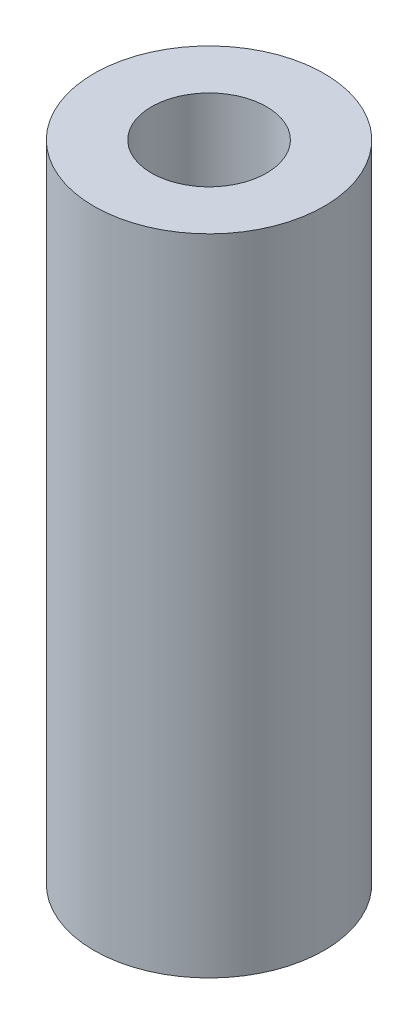
ISO-10303-21;
HEADER;
FILE_DESCRIPTION(('STEP AP214'),'2;1');
FILE_NAME('part.step','',(''),(''),'','','');
FILE_SCHEMA(('AUTOMOTIVE_DESIGN { 1 0 10303 214 1 1 1 1 }'));
ENDSEC;
DATA;
#1=APPLICATION_CONTEXT('core data for automotive mechanical design processes');
#2=APPLICATION_PROTOCOL_DEFINITION('international standard','automotive_design',2000,#1);
#3=PRODUCT_CONTEXT('',#1,'mechanical');
#4=PRODUCT('Part','Part','',(#3));
#5=PRODUCT_RELATED_PRODUCT_CATEGORY('part','',(#4));
#6=PRODUCT_DEFINITION_FORMATION('','',#4);
#7=PRODUCT_DEFINITION_CONTEXT('part definition',#1,'design');
#8=PRODUCT_DEFINITION('design','',#6,#7);
#9=PRODUCT_DEFINITION_SHAPE('','',#8);
#10=(LENGTH_UNIT() NAMED_UNIT(*) SI_UNIT(.MILLI.,.METRE.));
#11=(NAMED_UNIT(*) PLANE_ANGLE_UNIT() SI_UNIT($,.RADIAN.));
#12=(NAMED_UNIT(*) SI_UNIT($,.STERADIAN.) SOLID_ANGLE_UNIT());
#13=UNCERTAINTY_MEASURE_WITH_UNIT(LENGTH_MEASURE(1.E-05),#10,'distance_accuracy_value','');
#14=(GEOMETRIC_REPRESENTATION_CONTEXT(3) GLOBAL_UNCERTAINTY_ASSIGNED_CONTEXT((#13)) GLOBAL_UNIT_ASSIGNED_CONTEXT((#10,
#11,#12)) REPRESENTATION_CONTEXT('',''));
#15=CARTESIAN_POINT('',(0.,0.,0.));
#16=DIRECTION('',(0.,0.,1.));
#17=DIRECTION('',(1.,0.,0.));
#18=AXIS2_PLACEMENT_3D('',#15,#16,#17);
#19=CARTESIAN_POINT('',(0.,14.,0.));
#20=DIRECTION('',(0.,1.,0.));
#21=DIRECTION('',(0.,0.,1.));
#22=AXIS2_PLACEMENT_3D('',#19,#20,#21);
#23=PLANE('',#22);
#24=CARTESIAN_POINT('',(0.,14.,0.));
#25=DIRECTION('',(0.,1.,0.));
#26=DIRECTION('',(0.,0.,1.));
#27=AXIS2_PLACEMENT_3D('',#24,#25,#26);
#28=CIRCLE('',#27,2.5);
#29=CARTESIAN_POINT('',(0.,14.,2.5));
#30=VERTEX_POINT('',#29);
#31=EDGE_CURVE('E10',#30,#30,#28,.T.);
#32=ORIENTED_EDGE('',*,*,#31,.T.);
#33=EDGE_LOOP('',(#32));
#34=FACE_BOUND('',#33,.T.);
#35=CARTESIAN_POINT('',(0.,14.,0.));
#36=DIRECTION('',(0.,1.,0.));
#37=DIRECTION('',(0.,0.,1.));
#38=AXIS2_PLACEMENT_3D('',#35,#36,#37);
#39=CIRCLE('',#38,1.25);
#40=CARTESIAN_POINT('',(0.,14.,1.25));
#41=VERTEX_POINT('',#40);
#42=EDGE_CURVE('E48',#41,#41,#39,.T.);
#43=ORIENTED_EDGE('',*,*,#42,.F.);
#44=EDGE_LOOP('',(#43));
#45=FACE_BOUND('',#44,.T.);
#46=ADVANCED_FACE('F37',(#34,#45),#23,.T.);
#47=CARTESIAN_POINT('',(0.,0.,0.));
#48=DIRECTION('',(0.,1.,0.));
#49=DIRECTION('',(0.,0.,1.));
#50=AXIS2_PLACEMENT_3D('',#47,#48,#49);
#51=PLANE('',#50);
#52=CARTESIAN_POINT('',(0.,0.,0.));
#53=DIRECTION('',(0.,1.,0.));
#54=DIRECTION('',(0.,0.,1.));
#55=AXIS2_PLACEMENT_3D('',#52,#53,#54);
#56=CIRCLE('',#55,2.5);
#57=CARTESIAN_POINT('',(0.,0.,2.5));
#58=VERTEX_POINT('',#57);
#59=EDGE_CURVE('E41',#58,#58,#56,.T.);
#60=ORIENTED_EDGE('',*,*,#59,.F.);
#61=EDGE_LOOP('',(#60));
#62=FACE_BOUND('',#61,.T.);
#63=CARTESIAN_POINT('',(0.,0.,0.));
#64=DIRECTION('',(0.,1.,0.));
#65=DIRECTION('',(0.,0.,1.));
#66=AXIS2_PLACEMENT_3D('',#63,#64,#65);
#67=CIRCLE('',#66,1.25);
#68=CARTESIAN_POINT('',(0.,0.,1.25));
#69=VERTEX_POINT('',#68);
#70=EDGE_CURVE('E50',#69,#69,#67,.T.);
#71=ORIENTED_EDGE('',*,*,#70,.T.);
#72=EDGE_LOOP('',(#71));
#73=FACE_BOUND('',#72,.T.);
#74=ADVANCED_FACE('F60',(#62,#73),#51,.F.);
#75=CARTESIAN_POINT('',(0.,14.,0.));
#76=DIRECTION('',(0.,-1.,0.));
#77=DIRECTION('',(0.,0.,-1.));
#78=AXIS2_PLACEMENT_3D('',#75,#76,#77);
#79=CYLINDRICAL_SURFACE('',#78,2.5);
#80=ORIENTED_EDGE('',*,*,#31,.F.);
#81=EDGE_LOOP('',(#80));
#82=FACE_BOUND('',#81,.T.);
#83=ORIENTED_EDGE('',*,*,#59,.T.);
#84=EDGE_LOOP('',(#83));
#85=FACE_BOUND('',#84,.T.);
#86=ADVANCED_FACE('F39',(#82,#85),#79,.T.);
#87=CARTESIAN_POINT('',(0.,14.,0.));
#88=DIRECTION('',(0.,-1.,0.));
#89=DIRECTION('',(0.,0.,-1.));
#90=AXIS2_PLACEMENT_3D('',#87,#88,#89);
#91=CYLINDRICAL_SURFACE('',#90,1.25);
#92=ORIENTED_EDGE('',*,*,#42,.T.);
#93=EDGE_LOOP('',(#92));
#94=FACE_BOUND('',#93,.T.);
#95=ORIENTED_EDGE('',*,*,#70,.F.);
#96=EDGE_LOOP('',(#95));
#97=FACE_BOUND('',#96,.T.);
#98=ADVANCED_FACE('F56',(#94,#97),#91,.F.);
#99=CLOSED_SHELL('',(#46,#74,#86,#98));
#100=MANIFOLD_SOLID_BREP('B2',#99);
#101=ADVANCED_BREP_SHAPE_REPRESENTATION('',(#18,#100),#14);
#102=SHAPE_DEFINITION_REPRESENTATION(#9,#101);
ENDSEC;
END-ISO-10303-21;
